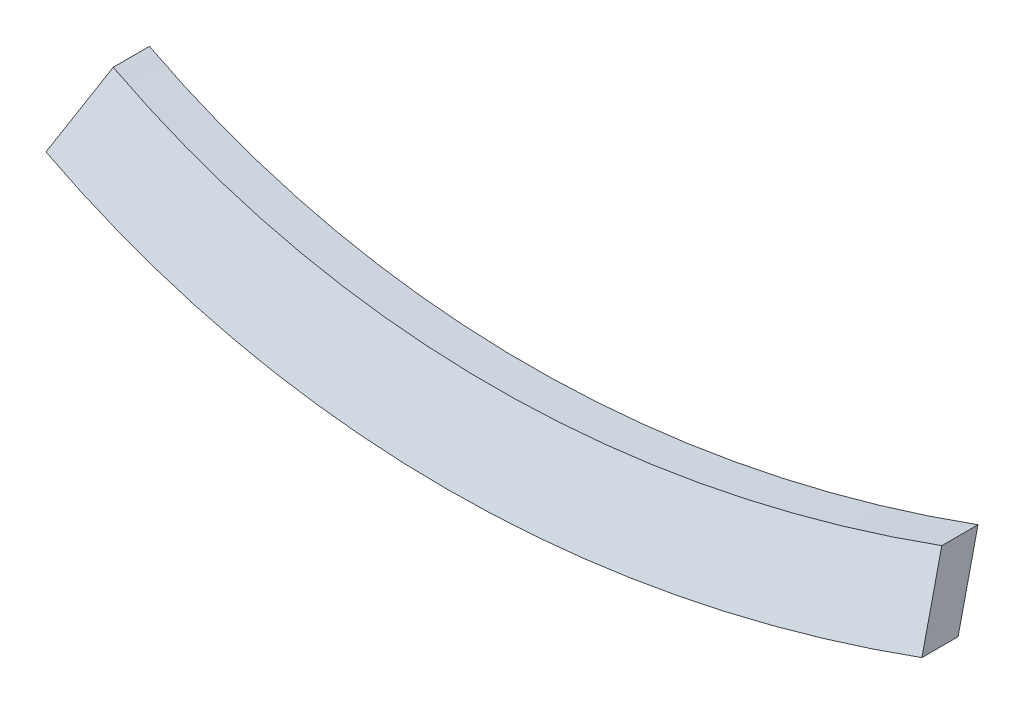
ISO-10303-21;
HEADER;
FILE_DESCRIPTION(('STEP AP214'),'2;1');
FILE_NAME('part.step','',(''),(''),'','','');
FILE_SCHEMA(('AUTOMOTIVE_DESIGN { 1 0 10303 214 1 1 1 1 }'));
ENDSEC;
DATA;
#1=APPLICATION_CONTEXT('core data for automotive mechanical design processes');
#2=APPLICATION_PROTOCOL_DEFINITION('international standard','automotive_design',2000,#1);
#3=PRODUCT_CONTEXT('',#1,'mechanical');
#4=PRODUCT('Part','Part','',(#3));
#5=PRODUCT_RELATED_PRODUCT_CATEGORY('part','',(#4));
#6=PRODUCT_DEFINITION_FORMATION('','',#4);
#7=PRODUCT_DEFINITION_CONTEXT('part definition',#1,'design');
#8=PRODUCT_DEFINITION('design','',#6,#7);
#9=PRODUCT_DEFINITION_SHAPE('','',#8);
#10=(LENGTH_UNIT() NAMED_UNIT(*) SI_UNIT(.MILLI.,.METRE.));
#11=(NAMED_UNIT(*) PLANE_ANGLE_UNIT() SI_UNIT($,.RADIAN.));
#12=(NAMED_UNIT(*) SI_UNIT($,.STERADIAN.) SOLID_ANGLE_UNIT());
#13=UNCERTAINTY_MEASURE_WITH_UNIT(LENGTH_MEASURE(1.E-05),#10,'distance_accuracy_value','');
#14=(GEOMETRIC_REPRESENTATION_CONTEXT(3) GLOBAL_UNCERTAINTY_ASSIGNED_CONTEXT((#13)) GLOBAL_UNIT_ASSIGNED_CONTEXT((#10,
#11,#12)) REPRESENTATION_CONTEXT('',''));
#15=CARTESIAN_POINT('',(0.,0.,0.));
#16=DIRECTION('',(0.,0.,1.));
#17=DIRECTION('',(1.,0.,0.));
#18=AXIS2_PLACEMENT_3D('',#15,#16,#17);
#19=CARTESIAN_POINT('',(0.,69.1525025117447,118.617515509882));
#20=DIRECTION('',(0.,-0.566406236924833,-0.824126188622016));
#21=DIRECTION('',(0.,0.824126188622016,-0.566406236924833));
#22=AXIS2_PLACEMENT_3D('',#19,#20,#21);
#23=PLANE('',#22);
#24=DIRECTION('',(0.293972273663318,-0.787711305620155,0.541378981227948));
#25=VECTOR('',#24,1.);
#26=CARTESIAN_POINT('',(217.703350725231,-79.5152116957514,220.794004643521));
#27=LINE('',#26,#25);
#28=CARTESIAN_POINT('',(205.944459778699,-48.0067594709452,199.138845394403));
#29=VERTEX_POINT('',#28);
#30=CARTESIAN_POINT('',(217.703350725231,-79.5152116957514,220.794004643521));
#31=VERTEX_POINT('',#30);
#32=EDGE_CURVE('E81',#29,#31,#27,.T.);
#33=ORIENTED_EDGE('',*,*,#32,.F.);
#34=CARTESIAN_POINT('',(0.,503.830246366241,-180.128220969222));
#35=DIRECTION('',(0.,0.566406236924832,0.824126188622016));
#36=DIRECTION('',(0.,0.824126188622016,-0.566406236924832));
#37=AXIS2_PLACEMENT_3D('',#34,#35,#36);
#38=CIRCLE('',#37,700.557427448286);
#39=CARTESIAN_POINT('',(-205.944459778699,-48.0067594709453,199.138845394403));
#40=VERTEX_POINT('',#39);
#41=EDGE_CURVE('E88',#40,#29,#38,.T.);
#42=ORIENTED_EDGE('',*,*,#41,.F.);
#43=DIRECTION('',(0.293972273663318,0.787711305620154,-0.541378981227948));
#44=VECTOR('',#43,1.);
#45=CARTESIAN_POINT('',(-217.703350725231,-79.5152116957515,220.794004643521));
#46=LINE('',#45,#44);
#47=CARTESIAN_POINT('',(-217.703350725231,-79.5152116957514,220.794004643521));
#48=VERTEX_POINT('',#47);
#49=EDGE_CURVE('E115',#48,#40,#46,.T.);
#50=ORIENTED_EDGE('',*,*,#49,.F.);
#51=CARTESIAN_POINT('',(0.,503.830246366241,-180.128220969222));
#52=DIRECTION('',(0.,-0.566406236924832,-0.824126188622016));
#53=DIRECTION('',(0.,0.824126188622016,-0.566406236924832));
#54=AXIS2_PLACEMENT_3D('',#51,#52,#53);
#55=CIRCLE('',#54,740.557427448287);
#56=EDGE_CURVE('E50',#31,#48,#55,.T.);
#57=ORIENTED_EDGE('',*,*,#56,.F.);
#58=EDGE_LOOP('',(#33,#42,#50,#57));
#59=FACE_BOUND('',#58,.T.);
#60=ADVANCED_FACE('F40',(#59),#23,.F.);
#61=CARTESIAN_POINT('',(0.,69.1525025117447,100.617515509882));
#62=DIRECTION('',(0.,-0.566406236924833,-0.824126188622016));
#63=DIRECTION('',(0.,0.824126188622016,-0.566406236924833));
#64=AXIS2_PLACEMENT_3D('',#61,#62,#63);
#65=PLANE('',#64);
#66=DIRECTION('',(0.293972273663318,-0.787711305620155,0.541378981227948));
#67=VECTOR('',#66,1.);
#68=CARTESIAN_POINT('',(217.703350725231,-79.5152116957514,202.794004643521));
#69=LINE('',#68,#67);
#70=CARTESIAN_POINT('',(205.944459778699,-48.0067594709452,181.138845394403));
#71=VERTEX_POINT('',#70);
#72=CARTESIAN_POINT('',(217.703350725231,-79.5152116957514,202.794004643521));
#73=VERTEX_POINT('',#72);
#74=EDGE_CURVE('E100',#71,#73,#69,.T.);
#75=ORIENTED_EDGE('',*,*,#74,.T.);
#76=CARTESIAN_POINT('',(0.,503.830246366241,-198.128220969222));
#77=DIRECTION('',(0.,-0.566406236924832,-0.824126188622016));
#78=DIRECTION('',(0.,0.824126188622016,-0.566406236924832));
#79=AXIS2_PLACEMENT_3D('',#76,#77,#78);
#80=CIRCLE('',#79,740.557427448287);
#81=CARTESIAN_POINT('',(-217.703350725231,-79.5152116957514,202.794004643521));
#82=VERTEX_POINT('',#81);
#83=EDGE_CURVE('E12',#73,#82,#80,.T.);
#84=ORIENTED_EDGE('',*,*,#83,.T.);
#85=DIRECTION('',(0.293972273663318,0.787711305620154,-0.541378981227948));
#86=VECTOR('',#85,1.);
#87=CARTESIAN_POINT('',(-217.703350725231,-79.5152116957515,202.794004643521));
#88=LINE('',#87,#86);
#89=CARTESIAN_POINT('',(-205.944459778698,-48.0067594709453,181.138845394403));
#90=VERTEX_POINT('',#89);
#91=EDGE_CURVE('E59',#82,#90,#88,.T.);
#92=ORIENTED_EDGE('',*,*,#91,.T.);
#93=CARTESIAN_POINT('',(0.,503.830246366241,-198.128220969222));
#94=DIRECTION('',(0.,0.566406236924832,0.824126188622016));
#95=DIRECTION('',(0.,0.824126188622016,-0.566406236924832));
#96=AXIS2_PLACEMENT_3D('',#93,#94,#95);
#97=CIRCLE('',#96,700.557427448286);
#98=EDGE_CURVE('E119',#90,#71,#97,.T.);
#99=ORIENTED_EDGE('',*,*,#98,.T.);
#100=EDGE_LOOP('',(#75,#84,#92,#99));
#101=FACE_BOUND('',#100,.T.);
#102=ADVANCED_FACE('F145',(#101),#65,.T.);
#103=CARTESIAN_POINT('',(217.703350725231,-79.5152116957514,202.794004643521));
#104=DIRECTION('',(-0.936883057121433,-0.349642871053875,0.));
#105=DIRECTION('',(0.349642871053876,-0.936883057121433,0.));
#106=AXIS2_PLACEMENT_3D('',#103,#104,#105);
#107=PLANE('',#106);
#108=ORIENTED_EDGE('',*,*,#32,.T.);
#109=DIRECTION('',(0.,0.,1.));
#110=VECTOR('',#109,1.);
#111=CARTESIAN_POINT('',(217.703350725231,-79.5152116957514,202.794004643521));
#112=LINE('',#111,#110);
#113=EDGE_CURVE('E96',#73,#31,#112,.T.);
#114=ORIENTED_EDGE('',*,*,#113,.F.);
#115=ORIENTED_EDGE('',*,*,#74,.F.);
#116=DIRECTION('',(0.,0.,1.));
#117=VECTOR('',#116,1.);
#118=CARTESIAN_POINT('',(205.944459778699,-48.0067594709452,181.138845394403));
#119=LINE('',#118,#117);
#120=EDGE_CURVE('E90',#71,#29,#119,.T.);
#121=ORIENTED_EDGE('',*,*,#120,.T.);
#122=EDGE_LOOP('',(#108,#114,#115,#121));
#123=FACE_BOUND('',#122,.T.);
#124=ADVANCED_FACE('F98',(#123),#107,.F.);
#125=DIRECTION('',(0.,0.,1.));
#126=VECTOR('',#125,1.);
#127=SURFACE_OF_LINEAR_EXTRUSION('',#97,#126);
#128=ORIENTED_EDGE('',*,*,#41,.T.);
#129=ORIENTED_EDGE('',*,*,#120,.F.);
#130=ORIENTED_EDGE('',*,*,#98,.F.);
#131=DIRECTION('',(0.,0.,1.));
#132=VECTOR('',#131,1.);
#133=CARTESIAN_POINT('',(-205.944459778698,-48.0067594709453,181.138845394403));
#134=LINE('',#133,#132);
#135=EDGE_CURVE('E92',#90,#40,#134,.T.);
#136=ORIENTED_EDGE('',*,*,#135,.T.);
#137=EDGE_LOOP('',(#128,#129,#130,#136));
#138=FACE_BOUND('',#137,.T.);
#139=ADVANCED_FACE('F89',(#138),#127,.F.);
#140=CARTESIAN_POINT('',(-217.703350725231,-79.5152116957515,202.794004643521));
#141=DIRECTION('',(0.936883057121433,-0.349642871053876,0.));
#142=DIRECTION('',(0.349642871053876,0.936883057121433,0.));
#143=AXIS2_PLACEMENT_3D('',#140,#141,#142);
#144=PLANE('',#143);
#145=ORIENTED_EDGE('',*,*,#49,.T.);
#146=ORIENTED_EDGE('',*,*,#135,.F.);
#147=ORIENTED_EDGE('',*,*,#91,.F.);
#148=DIRECTION('',(0.,0.,1.));
#149=VECTOR('',#148,1.);
#150=CARTESIAN_POINT('',(-217.703350725231,-79.5152116957515,202.794004643521));
#151=LINE('',#150,#149);
#152=EDGE_CURVE('E118',#82,#48,#151,.T.);
#153=ORIENTED_EDGE('',*,*,#152,.T.);
#154=EDGE_LOOP('',(#145,#146,#147,#153));
#155=FACE_BOUND('',#154,.T.);
#156=ADVANCED_FACE('F139',(#155),#144,.F.);
#157=DIRECTION('',(0.,0.,1.));
#158=VECTOR('',#157,1.);
#159=SURFACE_OF_LINEAR_EXTRUSION('',#80,#158);
#160=ORIENTED_EDGE('',*,*,#56,.T.);
#161=ORIENTED_EDGE('',*,*,#152,.F.);
#162=ORIENTED_EDGE('',*,*,#83,.F.);
#163=ORIENTED_EDGE('',*,*,#113,.T.);
#164=EDGE_LOOP('',(#160,#161,#162,#163));
#165=FACE_BOUND('',#164,.T.);
#166=ADVANCED_FACE('F142',(#165),#159,.F.);
#167=CLOSED_SHELL('',(#60,#102,#124,#139,#156,#166));
#168=MANIFOLD_SOLID_BREP('B2',#167);
#169=ADVANCED_BREP_SHAPE_REPRESENTATION('',(#18,#168),#14);
#170=SHAPE_DEFINITION_REPRESENTATION(#9,#169);
ENDSEC;
END-ISO-10303-21;
